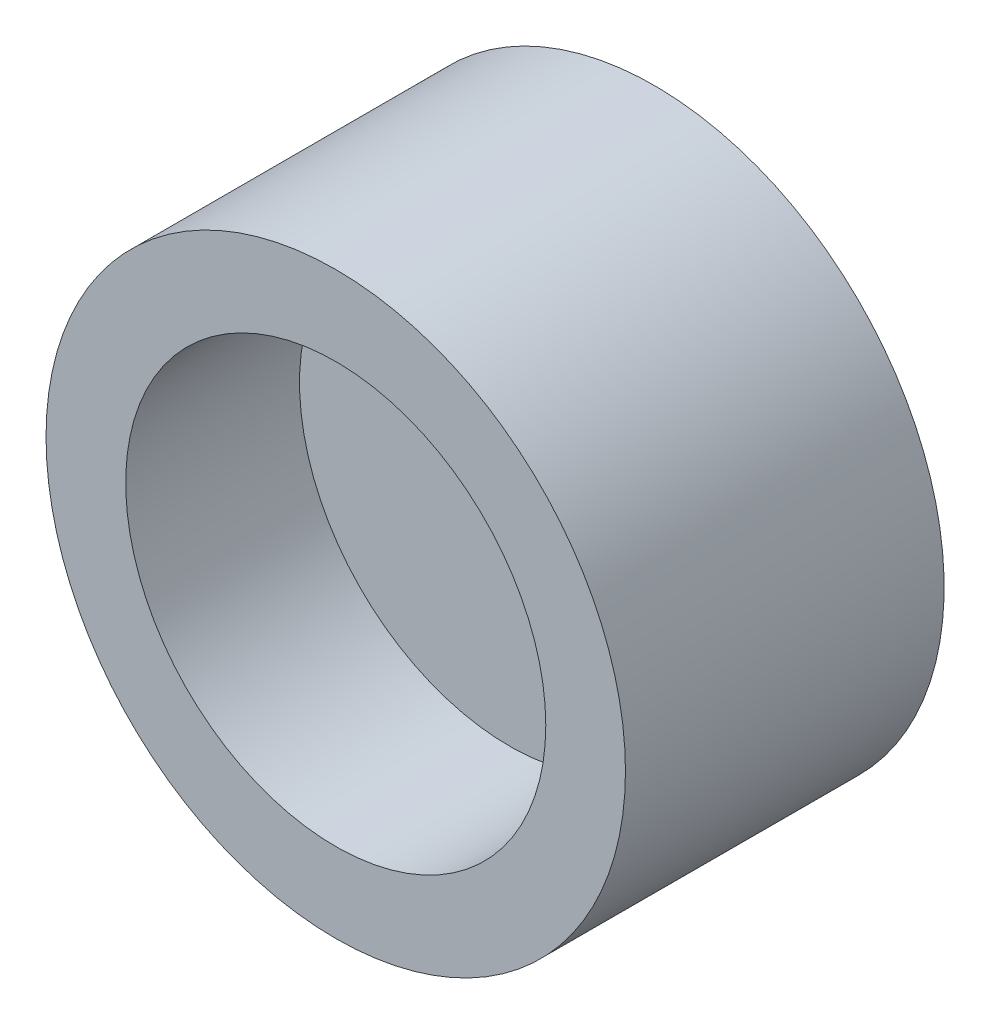
ISO-10303-21;
HEADER;
FILE_DESCRIPTION(('STEP AP214'),'2;1');
FILE_NAME('part.step','',(''),(''),'','','');
FILE_SCHEMA(('AUTOMOTIVE_DESIGN { 1 0 10303 214 1 1 1 1 }'));
ENDSEC;
DATA;
#1=APPLICATION_CONTEXT('core data for automotive mechanical design processes');
#2=APPLICATION_PROTOCOL_DEFINITION('international standard','automotive_design',2000,#1);
#3=PRODUCT_CONTEXT('',#1,'mechanical');
#4=PRODUCT('Part','Part','',(#3));
#5=PRODUCT_RELATED_PRODUCT_CATEGORY('part','',(#4));
#6=PRODUCT_DEFINITION_FORMATION('','',#4);
#7=PRODUCT_DEFINITION_CONTEXT('part definition',#1,'design');
#8=PRODUCT_DEFINITION('design','',#6,#7);
#9=PRODUCT_DEFINITION_SHAPE('','',#8);
#10=(LENGTH_UNIT() NAMED_UNIT(*) SI_UNIT(.MILLI.,.METRE.));
#11=(NAMED_UNIT(*) PLANE_ANGLE_UNIT() SI_UNIT($,.RADIAN.));
#12=(NAMED_UNIT(*) SI_UNIT($,.STERADIAN.) SOLID_ANGLE_UNIT());
#13=UNCERTAINTY_MEASURE_WITH_UNIT(LENGTH_MEASURE(1.E-05),#10,'distance_accuracy_value','');
#14=(GEOMETRIC_REPRESENTATION_CONTEXT(3) GLOBAL_UNCERTAINTY_ASSIGNED_CONTEXT((#13)) GLOBAL_UNIT_ASSIGNED_CONTEXT((#10,
#11,#12)) REPRESENTATION_CONTEXT('',''));
#15=CARTESIAN_POINT('',(0.,0.,0.));
#16=DIRECTION('',(0.,0.,1.));
#17=DIRECTION('',(1.,0.,0.));
#18=AXIS2_PLACEMENT_3D('',#15,#16,#17);
#19=CARTESIAN_POINT('',(0.,0.,1.2));
#20=DIRECTION('',(0.,0.,1.));
#21=DIRECTION('',(1.,0.,0.));
#22=AXIS2_PLACEMENT_3D('',#19,#20,#21);
#23=PLANE('',#22);
#24=CARTESIAN_POINT('',(0.,0.,1.2));
#25=DIRECTION('',(0.,0.,1.));
#26=DIRECTION('',(1.,0.,0.));
#27=AXIS2_PLACEMENT_3D('',#24,#25,#26);
#28=CIRCLE('',#27,2.);
#29=CARTESIAN_POINT('',(2.,0.,1.2));
#30=VERTEX_POINT('',#29);
#31=EDGE_CURVE('E10',#30,#30,#28,.T.);
#32=ORIENTED_EDGE('',*,*,#31,.T.);
#33=EDGE_LOOP('',(#32));
#34=FACE_BOUND('',#33,.T.);
#35=CARTESIAN_POINT('',(0.,0.,1.2));
#36=DIRECTION('',(0.,0.,1.));
#37=DIRECTION('',(1.,0.,0.));
#38=AXIS2_PLACEMENT_3D('',#35,#36,#37);
#39=CIRCLE('',#38,1.45);
#40=CARTESIAN_POINT('',(1.45,0.,1.2));
#41=VERTEX_POINT('',#40);
#42=EDGE_CURVE('E51',#41,#41,#39,.T.);
#43=ORIENTED_EDGE('',*,*,#42,.F.);
#44=EDGE_LOOP('',(#43));
#45=FACE_BOUND('',#44,.T.);
#46=ADVANCED_FACE('F43',(#34,#45),#23,.T.);
#47=CARTESIAN_POINT('',(0.,0.,1.2));
#48=DIRECTION('',(0.,0.,-1.));
#49=DIRECTION('',(-1.,0.,0.));
#50=AXIS2_PLACEMENT_3D('',#47,#48,#49);
#51=CYLINDRICAL_SURFACE('',#50,2.);
#52=ORIENTED_EDGE('',*,*,#31,.F.);
#53=EDGE_LOOP('',(#52));
#54=FACE_BOUND('',#53,.T.);
#55=CARTESIAN_POINT('',(0.,0.,-1.));
#56=DIRECTION('',(0.,0.,-1.));
#57=DIRECTION('',(-1.,0.,0.));
#58=AXIS2_PLACEMENT_3D('',#55,#56,#57);
#59=CIRCLE('',#58,2.);
#60=CARTESIAN_POINT('',(-2.,0.,-1.));
#61=VERTEX_POINT('',#60);
#62=EDGE_CURVE('E62',#61,#61,#59,.T.);
#63=ORIENTED_EDGE('',*,*,#62,.F.);
#64=EDGE_LOOP('',(#63));
#65=FACE_BOUND('',#64,.T.);
#66=ADVANCED_FACE('F45',(#54,#65),#51,.T.);
#67=CARTESIAN_POINT('',(0.,0.,1.2));
#68=DIRECTION('',(0.,0.,-1.));
#69=DIRECTION('',(-1.,0.,0.));
#70=AXIS2_PLACEMENT_3D('',#67,#68,#69);
#71=CYLINDRICAL_SURFACE('',#70,1.45);
#72=ORIENTED_EDGE('',*,*,#42,.T.);
#73=EDGE_LOOP('',(#72));
#74=FACE_BOUND('',#73,.T.);
#75=CARTESIAN_POINT('',(0.,0.,0.));
#76=DIRECTION('',(0.,0.,1.));
#77=DIRECTION('',(1.,0.,0.));
#78=AXIS2_PLACEMENT_3D('',#75,#76,#77);
#79=CIRCLE('',#78,1.45);
#80=CARTESIAN_POINT('',(1.45,0.,0.));
#81=VERTEX_POINT('',#80);
#82=EDGE_CURVE('E56',#81,#81,#79,.T.);
#83=ORIENTED_EDGE('',*,*,#82,.F.);
#84=EDGE_LOOP('',(#83));
#85=FACE_BOUND('',#84,.T.);
#86=ADVANCED_FACE('F71',(#74,#85),#71,.F.);
#87=CARTESIAN_POINT('',(0.,0.,0.));
#88=DIRECTION('',(0.,0.,-1.));
#89=DIRECTION('',(-1.,0.,0.));
#90=AXIS2_PLACEMENT_3D('',#87,#88,#89);
#91=PLANE('',#90);
#92=ORIENTED_EDGE('',*,*,#82,.T.);
#93=EDGE_LOOP('',(#92));
#94=FACE_BOUND('',#93,.T.);
#95=ADVANCED_FACE('F77',(#94),#91,.F.);
#96=CARTESIAN_POINT('',(0.,0.,-1.));
#97=DIRECTION('',(0.,0.,-1.));
#98=DIRECTION('',(-1.,0.,0.));
#99=AXIS2_PLACEMENT_3D('',#96,#97,#98);
#100=PLANE('',#99);
#101=ORIENTED_EDGE('',*,*,#62,.T.);
#102=EDGE_LOOP('',(#101));
#103=FACE_BOUND('',#102,.T.);
#104=ADVANCED_FACE('F68',(#103),#100,.T.);
#105=CLOSED_SHELL('',(#46,#66,#86,#95,#104));
#106=MANIFOLD_SOLID_BREP('B2',#105);
#107=ADVANCED_BREP_SHAPE_REPRESENTATION('',(#18,#106),#14);
#108=SHAPE_DEFINITION_REPRESENTATION(#9,#107);
ENDSEC;
END-ISO-10303-21;
